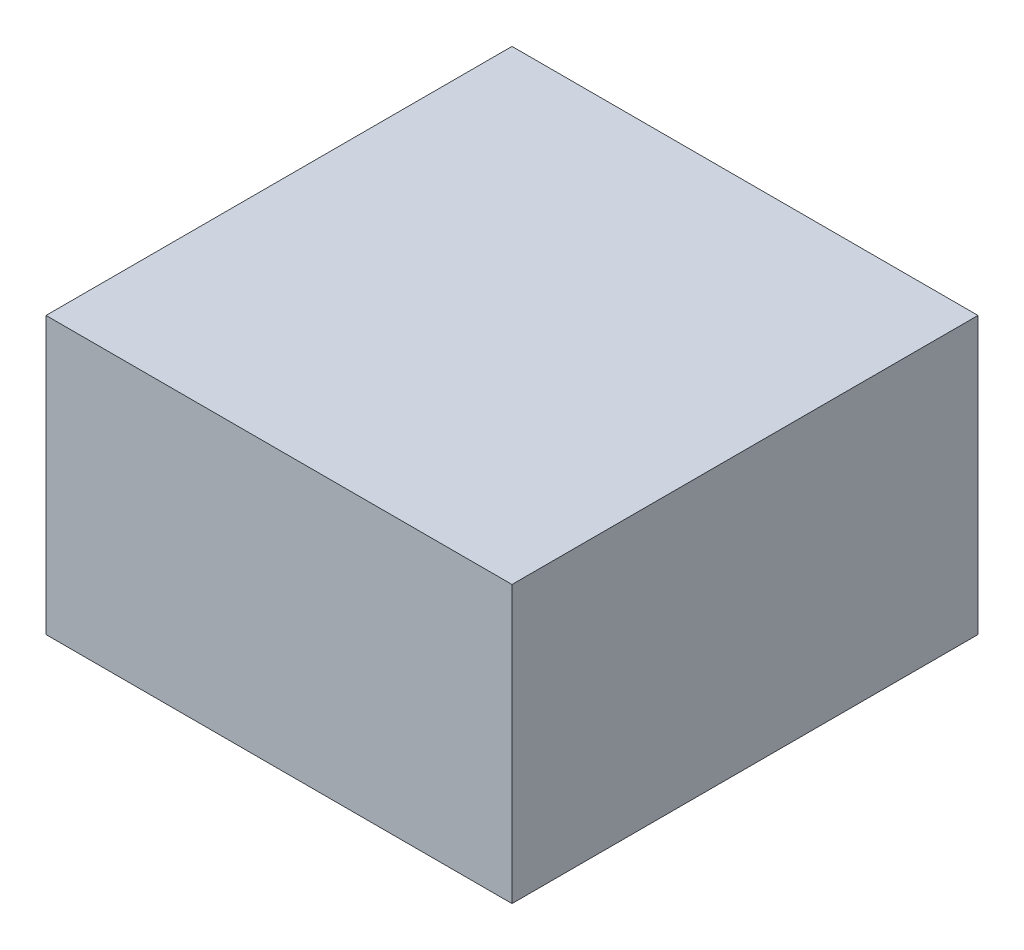
ISO-10303-21;
HEADER;
FILE_DESCRIPTION(('STEP AP214'),'2;1');
FILE_NAME('part.step','',(''),(''),'','','');
FILE_SCHEMA(('AUTOMOTIVE_DESIGN { 1 0 10303 214 1 1 1 1 }'));
ENDSEC;
DATA;
#1=APPLICATION_CONTEXT('core data for automotive mechanical design processes');
#2=APPLICATION_PROTOCOL_DEFINITION('international standard','automotive_design',2000,#1);
#3=PRODUCT_CONTEXT('',#1,'mechanical');
#4=PRODUCT('Part','Part','',(#3));
#5=PRODUCT_RELATED_PRODUCT_CATEGORY('part','',(#4));
#6=PRODUCT_DEFINITION_FORMATION('','',#4);
#7=PRODUCT_DEFINITION_CONTEXT('part definition',#1,'design');
#8=PRODUCT_DEFINITION('design','',#6,#7);
#9=PRODUCT_DEFINITION_SHAPE('','',#8);
#10=(LENGTH_UNIT() NAMED_UNIT(*) SI_UNIT(.MILLI.,.METRE.));
#11=(NAMED_UNIT(*) PLANE_ANGLE_UNIT() SI_UNIT($,.RADIAN.));
#12=(NAMED_UNIT(*) SI_UNIT($,.STERADIAN.) SOLID_ANGLE_UNIT());
#13=UNCERTAINTY_MEASURE_WITH_UNIT(LENGTH_MEASURE(1.E-05),#10,'distance_accuracy_value','');
#14=(GEOMETRIC_REPRESENTATION_CONTEXT(3) GLOBAL_UNCERTAINTY_ASSIGNED_CONTEXT((#13)) GLOBAL_UNIT_ASSIGNED_CONTEXT((#10,
#11,#12)) REPRESENTATION_CONTEXT('',''));
#15=CARTESIAN_POINT('',(0.,0.,0.));
#16=DIRECTION('',(0.,0.,1.));
#17=DIRECTION('',(1.,0.,0.));
#18=AXIS2_PLACEMENT_3D('',#15,#16,#17);
#19=CARTESIAN_POINT('',(-21.75,25.8,21.75));
#20=DIRECTION('',(1.,0.,0.));
#21=DIRECTION('',(0.,0.,-1.));
#22=AXIS2_PLACEMENT_3D('',#19,#20,#21);
#23=PLANE('',#22);
#24=DIRECTION('',(0.,0.,1.));
#25=VECTOR('',#24,1.);
#26=CARTESIAN_POINT('',(-21.75,0.,21.75));
#27=LINE('',#26,#25);
#28=CARTESIAN_POINT('',(-21.75,0.,-21.75));
#29=VERTEX_POINT('',#28);
#30=CARTESIAN_POINT('',(-21.75,0.,21.75));
#31=VERTEX_POINT('',#30);
#32=EDGE_CURVE('E103',#29,#31,#27,.T.);
#33=ORIENTED_EDGE('',*,*,#32,.T.);
#34=DIRECTION('',(0.,-1.,0.));
#35=VECTOR('',#34,1.);
#36=CARTESIAN_POINT('',(-21.75,25.8,21.75));
#37=LINE('',#36,#35);
#38=CARTESIAN_POINT('',(-21.75,25.8,21.75));
#39=VERTEX_POINT('',#38);
#40=EDGE_CURVE('E11',#39,#31,#37,.T.);
#41=ORIENTED_EDGE('',*,*,#40,.F.);
#42=DIRECTION('',(0.,0.,1.));
#43=VECTOR('',#42,1.);
#44=CARTESIAN_POINT('',(-21.75,25.8,21.75));
#45=LINE('',#44,#43);
#46=CARTESIAN_POINT('',(-21.75,25.8,-21.75));
#47=VERTEX_POINT('',#46);
#48=EDGE_CURVE('E91',#47,#39,#45,.T.);
#49=ORIENTED_EDGE('',*,*,#48,.F.);
#50=DIRECTION('',(0.,-1.,0.));
#51=VECTOR('',#50,1.);
#52=CARTESIAN_POINT('',(-21.75,25.8,-21.75));
#53=LINE('',#52,#51);
#54=EDGE_CURVE('E99',#47,#29,#53,.T.);
#55=ORIENTED_EDGE('',*,*,#54,.T.);
#56=EDGE_LOOP('',(#33,#41,#49,#55));
#57=FACE_BOUND('',#56,.T.);
#58=ADVANCED_FACE('F40',(#57),#23,.F.);
#59=CARTESIAN_POINT('',(21.75,25.8,21.75));
#60=DIRECTION('',(0.,0.,-1.));
#61=DIRECTION('',(-1.,0.,0.));
#62=AXIS2_PLACEMENT_3D('',#59,#60,#61);
#63=PLANE('',#62);
#64=DIRECTION('',(1.,0.,0.));
#65=VECTOR('',#64,1.);
#66=CARTESIAN_POINT('',(21.75,0.,21.75));
#67=LINE('',#66,#65);
#68=CARTESIAN_POINT('',(21.75,0.,21.75));
#69=VERTEX_POINT('',#68);
#70=EDGE_CURVE('E95',#31,#69,#67,.T.);
#71=ORIENTED_EDGE('',*,*,#70,.T.);
#72=DIRECTION('',(0.,-1.,0.));
#73=VECTOR('',#72,1.);
#74=CARTESIAN_POINT('',(21.75,25.8,21.75));
#75=LINE('',#74,#73);
#76=CARTESIAN_POINT('',(21.75,25.8,21.75));
#77=VERTEX_POINT('',#76);
#78=EDGE_CURVE('E48',#77,#69,#75,.T.);
#79=ORIENTED_EDGE('',*,*,#78,.F.);
#80=DIRECTION('',(1.,0.,0.));
#81=VECTOR('',#80,1.);
#82=CARTESIAN_POINT('',(21.75,25.8,21.75));
#83=LINE('',#82,#81);
#84=EDGE_CURVE('E86',#39,#77,#83,.T.);
#85=ORIENTED_EDGE('',*,*,#84,.F.);
#86=ORIENTED_EDGE('',*,*,#40,.T.);
#87=EDGE_LOOP('',(#71,#79,#85,#86));
#88=FACE_BOUND('',#87,.T.);
#89=ADVANCED_FACE('F94',(#88),#63,.F.);
#90=CARTESIAN_POINT('',(21.75,25.8,21.75));
#91=DIRECTION('',(-1.,0.,0.));
#92=DIRECTION('',(0.,0.,1.));
#93=AXIS2_PLACEMENT_3D('',#90,#91,#92);
#94=PLANE('',#93);
#95=DIRECTION('',(0.,0.,-1.));
#96=VECTOR('',#95,1.);
#97=CARTESIAN_POINT('',(21.75,0.,21.75));
#98=LINE('',#97,#96);
#99=CARTESIAN_POINT('',(21.75,0.,-21.75));
#100=VERTEX_POINT('',#99);
#101=EDGE_CURVE('E73',#69,#100,#98,.T.);
#102=ORIENTED_EDGE('',*,*,#101,.T.);
#103=DIRECTION('',(0.,-1.,0.));
#104=VECTOR('',#103,1.);
#105=CARTESIAN_POINT('',(21.75,25.8,-21.75));
#106=LINE('',#105,#104);
#107=CARTESIAN_POINT('',(21.75,25.8,-21.75));
#108=VERTEX_POINT('',#107);
#109=EDGE_CURVE('E96',#108,#100,#106,.T.);
#110=ORIENTED_EDGE('',*,*,#109,.F.);
#111=DIRECTION('',(0.,0.,-1.));
#112=VECTOR('',#111,1.);
#113=CARTESIAN_POINT('',(21.75,25.8,21.75));
#114=LINE('',#113,#112);
#115=EDGE_CURVE('E89',#77,#108,#114,.T.);
#116=ORIENTED_EDGE('',*,*,#115,.F.);
#117=ORIENTED_EDGE('',*,*,#78,.T.);
#118=EDGE_LOOP('',(#102,#110,#116,#117));
#119=FACE_BOUND('',#118,.T.);
#120=ADVANCED_FACE('F97',(#119),#94,.F.);
#121=CARTESIAN_POINT('',(21.75,25.8,-21.75));
#122=DIRECTION('',(0.,0.,1.));
#123=DIRECTION('',(1.,0.,0.));
#124=AXIS2_PLACEMENT_3D('',#121,#122,#123);
#125=PLANE('',#124);
#126=DIRECTION('',(-1.,0.,0.));
#127=VECTOR('',#126,1.);
#128=CARTESIAN_POINT('',(21.75,0.,-21.75));
#129=LINE('',#128,#127);
#130=EDGE_CURVE('E79',#100,#29,#129,.T.);
#131=ORIENTED_EDGE('',*,*,#130,.T.);
#132=ORIENTED_EDGE('',*,*,#54,.F.);
#133=DIRECTION('',(-1.,0.,0.));
#134=VECTOR('',#133,1.);
#135=CARTESIAN_POINT('',(21.75,25.8,-21.75));
#136=LINE('',#135,#134);
#137=EDGE_CURVE('E56',#108,#47,#136,.T.);
#138=ORIENTED_EDGE('',*,*,#137,.F.);
#139=ORIENTED_EDGE('',*,*,#109,.T.);
#140=EDGE_LOOP('',(#131,#132,#138,#139));
#141=FACE_BOUND('',#140,.T.);
#142=ADVANCED_FACE('F111',(#141),#125,.F.);
#143=CARTESIAN_POINT('',(0.,25.8,0.));
#144=DIRECTION('',(0.,1.,0.));
#145=DIRECTION('',(0.,0.,1.));
#146=AXIS2_PLACEMENT_3D('',#143,#144,#145);
#147=PLANE('',#146);
#148=ORIENTED_EDGE('',*,*,#48,.T.);
#149=ORIENTED_EDGE('',*,*,#84,.T.);
#150=ORIENTED_EDGE('',*,*,#115,.T.);
#151=ORIENTED_EDGE('',*,*,#137,.T.);
#152=EDGE_LOOP('',(#148,#149,#150,#151));
#153=FACE_BOUND('',#152,.T.);
#154=ADVANCED_FACE('F87',(#153),#147,.T.);
#155=CARTESIAN_POINT('',(0.,0.,0.));
#156=DIRECTION('',(0.,1.,0.));
#157=DIRECTION('',(0.,0.,1.));
#158=AXIS2_PLACEMENT_3D('',#155,#156,#157);
#159=PLANE('',#158);
#160=CARTESIAN_POINT('',(18.5,0.,18.5));
#161=DIRECTION('',(0.,-1.,0.));
#162=DIRECTION('',(0.,0.,-1.));
#163=AXIS2_PLACEMENT_3D('',#160,#161,#162);
#164=CIRCLE('',#163,1.5);
#165=CARTESIAN_POINT('',(18.5,0.,17.));
#166=VERTEX_POINT('',#165);
#167=EDGE_CURVE('E120',#166,#166,#164,.T.);
#168=ORIENTED_EDGE('',*,*,#167,.F.);
#169=EDGE_LOOP('',(#168));
#170=FACE_BOUND('',#169,.T.);
#171=CARTESIAN_POINT('',(-18.5,0.,-18.5));
#172=DIRECTION('',(0.,-1.,0.));
#173=DIRECTION('',(0.,0.,-1.));
#174=AXIS2_PLACEMENT_3D('',#171,#172,#173);
#175=CIRCLE('',#174,1.5);
#176=CARTESIAN_POINT('',(-18.5,0.,-20.));
#177=VERTEX_POINT('',#176);
#178=EDGE_CURVE('E126',#177,#177,#175,.T.);
#179=ORIENTED_EDGE('',*,*,#178,.F.);
#180=EDGE_LOOP('',(#179));
#181=FACE_BOUND('',#180,.T.);
#182=CARTESIAN_POINT('',(18.5,0.,-18.5));
#183=DIRECTION('',(0.,-1.,0.));
#184=DIRECTION('',(0.,0.,-1.));
#185=AXIS2_PLACEMENT_3D('',#182,#183,#184);
#186=CIRCLE('',#185,1.5);
#187=CARTESIAN_POINT('',(18.5,0.,-20.));
#188=VERTEX_POINT('',#187);
#189=EDGE_CURVE('E127',#188,#188,#186,.T.);
#190=ORIENTED_EDGE('',*,*,#189,.F.);
#191=EDGE_LOOP('',(#190));
#192=FACE_BOUND('',#191,.T.);
#193=CARTESIAN_POINT('',(-18.5,0.,18.5));
#194=DIRECTION('',(0.,-1.,0.));
#195=DIRECTION('',(0.,0.,-1.));
#196=AXIS2_PLACEMENT_3D('',#193,#194,#195);
#197=CIRCLE('',#196,1.5);
#198=CARTESIAN_POINT('',(-18.5,0.,17.));
#199=VERTEX_POINT('',#198);
#200=EDGE_CURVE('E117',#199,#199,#197,.T.);
#201=ORIENTED_EDGE('',*,*,#200,.F.);
#202=EDGE_LOOP('',(#201));
#203=FACE_BOUND('',#202,.T.);
#204=ORIENTED_EDGE('',*,*,#32,.F.);
#205=ORIENTED_EDGE('',*,*,#130,.F.);
#206=ORIENTED_EDGE('',*,*,#101,.F.);
#207=ORIENTED_EDGE('',*,*,#70,.F.);
#208=EDGE_LOOP('',(#204,#205,#206,#207));
#209=FACE_BOUND('',#208,.T.);
#210=ADVANCED_FACE('F114',(#170,#181,#192,#203,#209),#159,.F.);
#211=CARTESIAN_POINT('',(-18.5,10.,18.5));
#212=DIRECTION('',(0.,-1.,0.));
#213=DIRECTION('',(0.,0.,-1.));
#214=AXIS2_PLACEMENT_3D('',#211,#212,#213);
#215=CYLINDRICAL_SURFACE('',#214,1.5);
#216=CARTESIAN_POINT('',(-18.5,10.,18.5));
#217=DIRECTION('',(0.,-1.,0.));
#218=DIRECTION('',(0.,0.,-1.));
#219=AXIS2_PLACEMENT_3D('',#216,#217,#218);
#220=CIRCLE('',#219,1.5);
#221=CARTESIAN_POINT('',(-18.5,10.,17.));
#222=VERTEX_POINT('',#221);
#223=EDGE_CURVE('E106',#222,#222,#220,.T.);
#224=ORIENTED_EDGE('',*,*,#223,.F.);
#225=EDGE_LOOP('',(#224));
#226=FACE_BOUND('',#225,.T.);
#227=ORIENTED_EDGE('',*,*,#200,.T.);
#228=EDGE_LOOP('',(#227));
#229=FACE_BOUND('',#228,.T.);
#230=ADVANCED_FACE('F145',(#226,#229),#215,.F.);
#231=CARTESIAN_POINT('',(-18.5,10.,18.5));
#232=DIRECTION('',(0.,-1.,0.));
#233=DIRECTION('',(0.,0.,-1.));
#234=AXIS2_PLACEMENT_3D('',#231,#232,#233);
#235=PLANE('',#234);
#236=ORIENTED_EDGE('',*,*,#223,.T.);
#237=EDGE_LOOP('',(#236));
#238=FACE_BOUND('',#237,.T.);
#239=ADVANCED_FACE('F151',(#238),#235,.T.);
#240=CARTESIAN_POINT('',(18.5,10.,-18.5));
#241=DIRECTION('',(0.,-1.,0.));
#242=DIRECTION('',(0.,0.,-1.));
#243=AXIS2_PLACEMENT_3D('',#240,#241,#242);
#244=CYLINDRICAL_SURFACE('',#243,1.5);
#245=CARTESIAN_POINT('',(18.5,10.,-18.5));
#246=DIRECTION('',(0.,-1.,0.));
#247=DIRECTION('',(0.,0.,-1.));
#248=AXIS2_PLACEMENT_3D('',#245,#246,#247);
#249=CIRCLE('',#248,1.5);
#250=CARTESIAN_POINT('',(18.5,10.,-20.));
#251=VERTEX_POINT('',#250);
#252=EDGE_CURVE('E135',#251,#251,#249,.T.);
#253=ORIENTED_EDGE('',*,*,#252,.F.);
#254=EDGE_LOOP('',(#253));
#255=FACE_BOUND('',#254,.T.);
#256=ORIENTED_EDGE('',*,*,#189,.T.);
#257=EDGE_LOOP('',(#256));
#258=FACE_BOUND('',#257,.T.);
#259=ADVANCED_FACE('F141',(#255,#258),#244,.F.);
#260=CARTESIAN_POINT('',(18.5,10.,-18.5));
#261=DIRECTION('',(0.,-1.,0.));
#262=DIRECTION('',(0.,0.,-1.));
#263=AXIS2_PLACEMENT_3D('',#260,#261,#262);
#264=PLANE('',#263);
#265=ORIENTED_EDGE('',*,*,#252,.T.);
#266=EDGE_LOOP('',(#265));
#267=FACE_BOUND('',#266,.T.);
#268=ADVANCED_FACE('F202',(#267),#264,.T.);
#269=CARTESIAN_POINT('',(-18.5,10.,-18.5));
#270=DIRECTION('',(0.,-1.,0.));
#271=DIRECTION('',(0.,0.,-1.));
#272=AXIS2_PLACEMENT_3D('',#269,#270,#271);
#273=CYLINDRICAL_SURFACE('',#272,1.5);
#274=CARTESIAN_POINT('',(-18.5,10.,-18.5));
#275=DIRECTION('',(0.,-1.,0.));
#276=DIRECTION('',(0.,0.,-1.));
#277=AXIS2_PLACEMENT_3D('',#274,#275,#276);
#278=CIRCLE('',#277,1.5);
#279=CARTESIAN_POINT('',(-18.5,10.,-20.));
#280=VERTEX_POINT('',#279);
#281=EDGE_CURVE('E123',#280,#280,#278,.T.);
#282=ORIENTED_EDGE('',*,*,#281,.F.);
#283=EDGE_LOOP('',(#282));
#284=FACE_BOUND('',#283,.T.);
#285=ORIENTED_EDGE('',*,*,#178,.T.);
#286=EDGE_LOOP('',(#285));
#287=FACE_BOUND('',#286,.T.);
#288=ADVANCED_FACE('F213',(#284,#287),#273,.F.);
#289=CARTESIAN_POINT('',(-18.5,10.,-18.5));
#290=DIRECTION('',(0.,-1.,0.));
#291=DIRECTION('',(0.,0.,-1.));
#292=AXIS2_PLACEMENT_3D('',#289,#290,#291);
#293=PLANE('',#292);
#294=ORIENTED_EDGE('',*,*,#281,.T.);
#295=EDGE_LOOP('',(#294));
#296=FACE_BOUND('',#295,.T.);
#297=ADVANCED_FACE('F224',(#296),#293,.T.);
#298=CARTESIAN_POINT('',(18.5,10.,18.5));
#299=DIRECTION('',(0.,-1.,0.));
#300=DIRECTION('',(0.,0.,-1.));
#301=AXIS2_PLACEMENT_3D('',#298,#299,#300);
#302=CYLINDRICAL_SURFACE('',#301,1.5);
#303=CARTESIAN_POINT('',(18.5,10.,18.5));
#304=DIRECTION('',(0.,-1.,0.));
#305=DIRECTION('',(0.,0.,-1.));
#306=AXIS2_PLACEMENT_3D('',#303,#304,#305);
#307=CIRCLE('',#306,1.5);
#308=CARTESIAN_POINT('',(18.5,10.,17.));
#309=VERTEX_POINT('',#308);
#310=EDGE_CURVE('E130',#309,#309,#307,.T.);
#311=ORIENTED_EDGE('',*,*,#310,.F.);
#312=EDGE_LOOP('',(#311));
#313=FACE_BOUND('',#312,.T.);
#314=ORIENTED_EDGE('',*,*,#167,.T.);
#315=EDGE_LOOP('',(#314));
#316=FACE_BOUND('',#315,.T.);
#317=ADVANCED_FACE('F235',(#313,#316),#302,.F.);
#318=CARTESIAN_POINT('',(18.5,10.,18.5));
#319=DIRECTION('',(0.,-1.,0.));
#320=DIRECTION('',(0.,0.,-1.));
#321=AXIS2_PLACEMENT_3D('',#318,#319,#320);
#322=PLANE('',#321);
#323=ORIENTED_EDGE('',*,*,#310,.T.);
#324=EDGE_LOOP('',(#323));
#325=FACE_BOUND('',#324,.T.);
#326=ADVANCED_FACE('F246',(#325),#322,.T.);
#327=CLOSED_SHELL('',(#58,#89,#120,#142,#154,#210,#230,#239,#259,#268,#288,#297,#317,#326));
#328=MANIFOLD_SOLID_BREP('B2',#327);
#329=ADVANCED_BREP_SHAPE_REPRESENTATION('',(#18,#328),#14);
#330=SHAPE_DEFINITION_REPRESENTATION(#9,#329);
ENDSEC;
END-ISO-10303-21;
